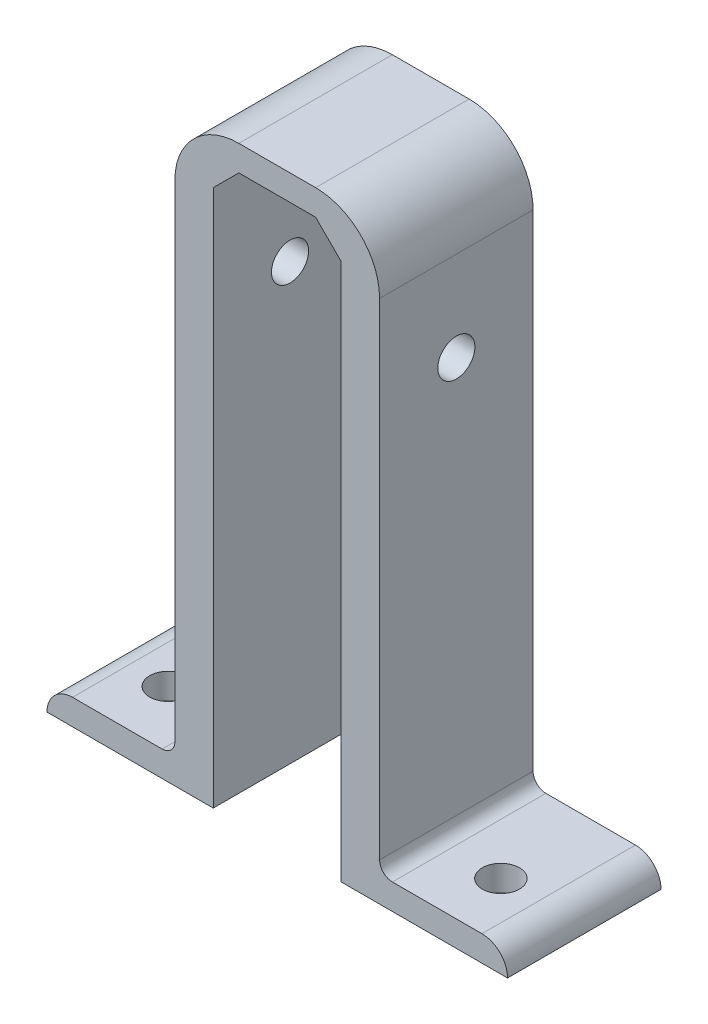
ISO-10303-21;
HEADER;
FILE_DESCRIPTION(('STEP AP214'),'2;1');
FILE_NAME('part.step','',(''),(''),'','','');
FILE_SCHEMA(('AUTOMOTIVE_DESIGN { 1 0 10303 214 1 1 1 1 }'));
ENDSEC;
DATA;
#1=APPLICATION_CONTEXT('core data for automotive mechanical design processes');
#2=APPLICATION_PROTOCOL_DEFINITION('international standard','automotive_design',2000,#1);
#3=PRODUCT_CONTEXT('',#1,'mechanical');
#4=PRODUCT('Part','Part','',(#3));
#5=PRODUCT_RELATED_PRODUCT_CATEGORY('part','',(#4));
#6=PRODUCT_DEFINITION_FORMATION('','',#4);
#7=PRODUCT_DEFINITION_CONTEXT('part definition',#1,'design');
#8=PRODUCT_DEFINITION('design','',#6,#7);
#9=PRODUCT_DEFINITION_SHAPE('','',#8);
#10=(LENGTH_UNIT() NAMED_UNIT(*) SI_UNIT(.MILLI.,.METRE.));
#11=(NAMED_UNIT(*) PLANE_ANGLE_UNIT() SI_UNIT($,.RADIAN.));
#12=(NAMED_UNIT(*) SI_UNIT($,.STERADIAN.) SOLID_ANGLE_UNIT());
#13=UNCERTAINTY_MEASURE_WITH_UNIT(LENGTH_MEASURE(1.E-05),#10,'distance_accuracy_value','');
#14=(GEOMETRIC_REPRESENTATION_CONTEXT(3) GLOBAL_UNCERTAINTY_ASSIGNED_CONTEXT((#13)) GLOBAL_UNIT_ASSIGNED_CONTEXT((#10,
#11,#12)) REPRESENTATION_CONTEXT('',''));
#15=CARTESIAN_POINT('',(0.,0.,0.));
#16=DIRECTION('',(0.,0.,1.));
#17=DIRECTION('',(1.,0.,0.));
#18=AXIS2_PLACEMENT_3D('',#15,#16,#17);
#19=CARTESIAN_POINT('',(0.,0.,12.));
#20=DIRECTION('',(0.,1.,0.));
#21=DIRECTION('',(0.,0.,1.));
#22=AXIS2_PLACEMENT_3D('',#19,#20,#21);
#23=PLANE('',#22);
#24=CARTESIAN_POINT('',(5.,0.,7.51917344477907));
#25=DIRECTION('',(0.,1.,0.));
#26=DIRECTION('',(0.,0.,1.));
#27=AXIS2_PLACEMENT_3D('',#24,#25,#26);
#28=CIRCLE('',#27,1.45);
#29=CARTESIAN_POINT('',(5.,0.,8.96917344477908));
#30=VERTEX_POINT('',#29);
#31=EDGE_CURVE('E376',#30,#30,#28,.T.);
#32=ORIENTED_EDGE('',*,*,#31,.T.);
#33=EDGE_LOOP('',(#32));
#34=FACE_BOUND('',#33,.T.);
#35=DIRECTION('',(1.,0.,0.));
#36=VECTOR('',#35,1.);
#37=CARTESIAN_POINT('',(0.,0.,0.));
#38=LINE('',#37,#36);
#39=CARTESIAN_POINT('',(0.,0.,0.));
#40=VERTEX_POINT('',#39);
#41=CARTESIAN_POINT('',(13.,0.,0.));
#42=VERTEX_POINT('',#41);
#43=EDGE_CURVE('E294',#40,#42,#38,.T.);
#44=ORIENTED_EDGE('',*,*,#43,.T.);
#45=DIRECTION('',(0.,0.,-1.));
#46=VECTOR('',#45,1.);
#47=CARTESIAN_POINT('',(13.,0.,12.));
#48=LINE('',#47,#46);
#49=CARTESIAN_POINT('',(13.,0.,12.));
#50=VERTEX_POINT('',#49);
#51=EDGE_CURVE('E176',#50,#42,#48,.T.);
#52=ORIENTED_EDGE('',*,*,#51,.F.);
#53=DIRECTION('',(1.,0.,0.));
#54=VECTOR('',#53,1.);
#55=CARTESIAN_POINT('',(0.,0.,12.));
#56=LINE('',#55,#54);
#57=CARTESIAN_POINT('',(0.,0.,12.));
#58=VERTEX_POINT('',#57);
#59=EDGE_CURVE('E162',#58,#50,#56,.T.);
#60=ORIENTED_EDGE('',*,*,#59,.F.);
#61=DIRECTION('',(0.,0.,-1.));
#62=VECTOR('',#61,1.);
#63=CARTESIAN_POINT('',(0.,0.,12.));
#64=LINE('',#63,#62);
#65=EDGE_CURVE('E174',#58,#40,#64,.T.);
#66=ORIENTED_EDGE('',*,*,#65,.T.);
#67=EDGE_LOOP('',(#44,#52,#60,#66));
#68=FACE_BOUND('',#67,.T.);
#69=ADVANCED_FACE('F34',(#34,#68),#23,.F.);
#70=CARTESIAN_POINT('',(13.,0.,12.));
#71=DIRECTION('',(-1.,0.,0.));
#72=DIRECTION('',(0.,0.,1.));
#73=AXIS2_PLACEMENT_3D('',#70,#71,#72);
#74=PLANE('',#73);
#75=CARTESIAN_POINT('',(13.,33.9999999999999,6.));
#76=DIRECTION('',(-1.,0.,0.));
#77=DIRECTION('',(0.,0.,1.));
#78=AXIS2_PLACEMENT_3D('',#75,#76,#77);
#79=CIRCLE('',#78,1.45);
#80=CARTESIAN_POINT('',(13.,33.9999999999999,7.45));
#81=VERTEX_POINT('',#80);
#82=EDGE_CURVE('E296',#81,#81,#79,.F.);
#83=ORIENTED_EDGE('',*,*,#82,.F.);
#84=EDGE_LOOP('',(#83));
#85=FACE_BOUND('',#84,.T.);
#86=DIRECTION('',(0.,1.,0.));
#87=VECTOR('',#86,1.);
#88=CARTESIAN_POINT('',(13.,0.,0.));
#89=LINE('',#88,#87);
#90=CARTESIAN_POINT('',(13.,42.,0.));
#91=VERTEX_POINT('',#90);
#92=EDGE_CURVE('E267',#42,#91,#89,.T.);
#93=ORIENTED_EDGE('',*,*,#92,.T.);
#94=DIRECTION('',(0.,0.,1.));
#95=VECTOR('',#94,1.);
#96=CARTESIAN_POINT('',(13.,42.,12.));
#97=LINE('',#96,#95);
#98=CARTESIAN_POINT('',(13.,42.,12.));
#99=VERTEX_POINT('',#98);
#100=EDGE_CURVE('E247',#91,#99,#97,.T.);
#101=ORIENTED_EDGE('',*,*,#100,.T.);
#102=DIRECTION('',(0.,1.,0.));
#103=VECTOR('',#102,1.);
#104=CARTESIAN_POINT('',(13.,0.,12.));
#105=LINE('',#104,#103);
#106=EDGE_CURVE('E178',#50,#99,#105,.T.);
#107=ORIENTED_EDGE('',*,*,#106,.F.);
#108=ORIENTED_EDGE('',*,*,#51,.T.);
#109=EDGE_LOOP('',(#93,#101,#107,#108));
#110=FACE_BOUND('',#109,.T.);
#111=ADVANCED_FACE('F363',(#85,#110),#74,.F.);
#112=CARTESIAN_POINT('',(13.,44.,12.));
#113=DIRECTION('',(0.,1.,0.));
#114=DIRECTION('',(0.,0.,1.));
#115=AXIS2_PLACEMENT_3D('',#112,#113,#114);
#116=PLANE('',#115);
#117=DIRECTION('',(1.,0.,0.));
#118=VECTOR('',#117,1.);
#119=CARTESIAN_POINT('',(13.,44.,12.));
#120=LINE('',#119,#118);
#121=CARTESIAN_POINT('',(15.,44.,12.));
#122=VERTEX_POINT('',#121);
#123=CARTESIAN_POINT('',(21.,44.,12.));
#124=VERTEX_POINT('',#123);
#125=EDGE_CURVE('E276',#122,#124,#120,.T.);
#126=ORIENTED_EDGE('',*,*,#125,.F.);
#127=DIRECTION('',(0.,0.,-1.));
#128=VECTOR('',#127,1.);
#129=CARTESIAN_POINT('',(15.,44.,0.));
#130=LINE('',#129,#128);
#131=CARTESIAN_POINT('',(15.,44.,0.));
#132=VERTEX_POINT('',#131);
#133=EDGE_CURVE('E244',#122,#132,#130,.T.);
#134=ORIENTED_EDGE('',*,*,#133,.T.);
#135=DIRECTION('',(1.,0.,0.));
#136=VECTOR('',#135,1.);
#137=CARTESIAN_POINT('',(13.,44.,0.));
#138=LINE('',#137,#136);
#139=CARTESIAN_POINT('',(21.,44.,0.));
#140=VERTEX_POINT('',#139);
#141=EDGE_CURVE('E260',#132,#140,#138,.T.);
#142=ORIENTED_EDGE('',*,*,#141,.T.);
#143=DIRECTION('',(0.,0.,1.));
#144=VECTOR('',#143,1.);
#145=CARTESIAN_POINT('',(21.,44.,12.));
#146=LINE('',#145,#144);
#147=EDGE_CURVE('E242',#140,#124,#146,.T.);
#148=ORIENTED_EDGE('',*,*,#147,.T.);
#149=EDGE_LOOP('',(#126,#134,#142,#148));
#150=FACE_BOUND('',#149,.T.);
#151=ADVANCED_FACE('F265',(#150),#116,.F.);
#152=CARTESIAN_POINT('',(22.9999999999997,0.,12.));
#153=DIRECTION('',(1.,0.,0.));
#154=DIRECTION('',(0.,1.,0.));
#155=AXIS2_PLACEMENT_3D('',#152,#153,#154);
#156=PLANE('',#155);
#157=CARTESIAN_POINT('',(22.9999999999999,33.9999999999999,6.));
#158=DIRECTION('',(1.,0.,0.));
#159=DIRECTION('',(0.,1.,0.));
#160=AXIS2_PLACEMENT_3D('',#157,#158,#159);
#161=CIRCLE('',#160,1.45);
#162=CARTESIAN_POINT('',(22.9999999999999,35.4499999999999,6.));
#163=VERTEX_POINT('',#162);
#164=EDGE_CURVE('E369',#163,#163,#161,.F.);
#165=ORIENTED_EDGE('',*,*,#164,.F.);
#166=EDGE_LOOP('',(#165));
#167=FACE_BOUND('',#166,.T.);
#168=DIRECTION('',(0.,-1.,0.));
#169=VECTOR('',#168,1.);
#170=CARTESIAN_POINT('',(22.9999999999997,0.,12.));
#171=LINE('',#170,#169);
#172=CARTESIAN_POINT('',(23.,42.,12.));
#173=VERTEX_POINT('',#172);
#174=CARTESIAN_POINT('',(22.9999999999997,0.,12.));
#175=VERTEX_POINT('',#174);
#176=EDGE_CURVE('E273',#173,#175,#171,.T.);
#177=ORIENTED_EDGE('',*,*,#176,.F.);
#178=DIRECTION('',(0.,0.,-1.));
#179=VECTOR('',#178,1.);
#180=CARTESIAN_POINT('',(23.,42.,0.));
#181=LINE('',#180,#179);
#182=CARTESIAN_POINT('',(23.,42.,0.));
#183=VERTEX_POINT('',#182);
#184=EDGE_CURVE('E249',#173,#183,#181,.T.);
#185=ORIENTED_EDGE('',*,*,#184,.T.);
#186=DIRECTION('',(0.,-1.,0.));
#187=VECTOR('',#186,1.);
#188=CARTESIAN_POINT('',(22.9999999999997,0.,0.));
#189=LINE('',#188,#187);
#190=CARTESIAN_POINT('',(22.9999999999997,0.,0.));
#191=VERTEX_POINT('',#190);
#192=EDGE_CURVE('E262',#183,#191,#189,.T.);
#193=ORIENTED_EDGE('',*,*,#192,.T.);
#194=DIRECTION('',(0.,0.,-1.));
#195=VECTOR('',#194,1.);
#196=CARTESIAN_POINT('',(22.9999999999997,0.,12.));
#197=LINE('',#196,#195);
#198=EDGE_CURVE('E189',#175,#191,#197,.T.);
#199=ORIENTED_EDGE('',*,*,#198,.F.);
#200=EDGE_LOOP('',(#177,#185,#193,#199));
#201=FACE_BOUND('',#200,.T.);
#202=ADVANCED_FACE('F270',(#167,#201),#156,.F.);
#203=CARTESIAN_POINT('',(35.9999999999997,-1.2490009027033E-13,12.));
#204=DIRECTION('',(0.,1.,0.));
#205=DIRECTION('',(-1.,0.,0.));
#206=AXIS2_PLACEMENT_3D('',#203,#204,#205);
#207=PLANE('',#206);
#208=CARTESIAN_POINT('',(31.,0.,7.51917344477907));
#209=DIRECTION('',(0.,1.,0.));
#210=DIRECTION('',(-1.,0.,0.));
#211=AXIS2_PLACEMENT_3D('',#208,#209,#210);
#212=CIRCLE('',#211,1.45);
#213=CARTESIAN_POINT('',(29.55,0.,7.51917344477907));
#214=VERTEX_POINT('',#213);
#215=EDGE_CURVE('E196',#214,#214,#212,.T.);
#216=ORIENTED_EDGE('',*,*,#215,.T.);
#217=EDGE_LOOP('',(#216));
#218=FACE_BOUND('',#217,.T.);
#219=DIRECTION('',(1.,0.,0.));
#220=VECTOR('',#219,1.);
#221=CARTESIAN_POINT('',(35.9999999999997,-1.2490009027033E-13,0.));
#222=LINE('',#221,#220);
#223=CARTESIAN_POINT('',(35.9999999999997,-1.2490009027033E-13,0.));
#224=VERTEX_POINT('',#223);
#225=EDGE_CURVE('E300',#191,#224,#222,.T.);
#226=ORIENTED_EDGE('',*,*,#225,.T.);
#227=DIRECTION('',(0.,0.,-1.));
#228=VECTOR('',#227,1.);
#229=CARTESIAN_POINT('',(35.9999999999997,-1.2490009027033E-13,12.));
#230=LINE('',#229,#228);
#231=CARTESIAN_POINT('',(35.9999999999997,-1.2490009027033E-13,12.));
#232=VERTEX_POINT('',#231);
#233=EDGE_CURVE('E293',#232,#224,#230,.T.);
#234=ORIENTED_EDGE('',*,*,#233,.F.);
#235=DIRECTION('',(1.,0.,0.));
#236=VECTOR('',#235,1.);
#237=CARTESIAN_POINT('',(35.9999999999997,-1.2490009027033E-13,12.));
#238=LINE('',#237,#236);
#239=EDGE_CURVE('E275',#175,#232,#238,.T.);
#240=ORIENTED_EDGE('',*,*,#239,.F.);
#241=ORIENTED_EDGE('',*,*,#198,.T.);
#242=EDGE_LOOP('',(#226,#234,#240,#241));
#243=FACE_BOUND('',#242,.T.);
#244=ADVANCED_FACE('F317',(#218,#243),#207,.F.);
#245=CARTESIAN_POINT('',(25.9999999999997,1.99999999999995,12.));
#246=DIRECTION('',(0.,-1.,0.));
#247=DIRECTION('',(1.,0.,0.));
#248=AXIS2_PLACEMENT_3D('',#245,#246,#247);
#249=PLANE('',#248);
#250=CARTESIAN_POINT('',(31.,2.,7.51917344477907));
#251=DIRECTION('',(0.,1.,0.));
#252=DIRECTION('',(1.,0.,0.));
#253=AXIS2_PLACEMENT_3D('',#250,#251,#252);
#254=CIRCLE('',#253,1.45);
#255=CARTESIAN_POINT('',(32.45,2.,7.51917344477907));
#256=VERTEX_POINT('',#255);
#257=EDGE_CURVE('E380',#256,#256,#254,.T.);
#258=ORIENTED_EDGE('',*,*,#257,.F.);
#259=EDGE_LOOP('',(#258));
#260=FACE_BOUND('',#259,.T.);
#261=DIRECTION('',(-1.,0.,0.));
#262=VECTOR('',#261,1.);
#263=CARTESIAN_POINT('',(25.9999999999997,1.99999999999995,12.));
#264=LINE('',#263,#262);
#265=CARTESIAN_POINT('',(33.9999999999997,1.99999999999989,12.));
#266=VERTEX_POINT('',#265);
#267=CARTESIAN_POINT('',(26.9999999999997,1.99999999999994,12.));
#268=VERTEX_POINT('',#267);
#269=EDGE_CURVE('E278',#266,#268,#264,.T.);
#270=ORIENTED_EDGE('',*,*,#269,.F.);
#271=DIRECTION('',(0.,0.,-1.));
#272=VECTOR('',#271,1.);
#273=CARTESIAN_POINT('',(33.9999999999997,1.99999999999989,12.));
#274=LINE('',#273,#272);
#275=CARTESIAN_POINT('',(33.9999999999997,1.99999999999989,0.));
#276=VERTEX_POINT('',#275);
#277=EDGE_CURVE('E234',#266,#276,#274,.T.);
#278=ORIENTED_EDGE('',*,*,#277,.T.);
#279=DIRECTION('',(-1.,0.,0.));
#280=VECTOR('',#279,1.);
#281=CARTESIAN_POINT('',(25.9999999999997,1.99999999999995,0.));
#282=LINE('',#281,#280);
#283=CARTESIAN_POINT('',(26.9999999999997,1.99999999999994,0.));
#284=VERTEX_POINT('',#283);
#285=EDGE_CURVE('E303',#276,#284,#282,.T.);
#286=ORIENTED_EDGE('',*,*,#285,.T.);
#287=DIRECTION('',(0.,0.,-1.));
#288=VECTOR('',#287,1.);
#289=CARTESIAN_POINT('',(26.9999999999997,1.99999999999994,12.));
#290=LINE('',#289,#288);
#291=EDGE_CURVE('E187',#284,#268,#290,.F.);
#292=ORIENTED_EDGE('',*,*,#291,.T.);
#293=EDGE_LOOP('',(#270,#278,#286,#292));
#294=FACE_BOUND('',#293,.T.);
#295=ADVANCED_FACE('F325',(#260,#294),#249,.F.);
#296=CARTESIAN_POINT('',(26.,46.,12.));
#297=DIRECTION('',(-1.,0.,0.));
#298=DIRECTION('',(0.,-1.,0.));
#299=AXIS2_PLACEMENT_3D('',#296,#297,#298);
#300=PLANE('',#299);
#301=CARTESIAN_POINT('',(25.9999999999999,33.9999999999999,6.));
#302=DIRECTION('',(-1.,0.,0.));
#303=DIRECTION('',(0.,-1.,0.));
#304=AXIS2_PLACEMENT_3D('',#301,#302,#303);
#305=CIRCLE('',#304,1.45);
#306=CARTESIAN_POINT('',(25.9999999999999,32.5499999999999,6.));
#307=VERTEX_POINT('',#306);
#308=EDGE_CURVE('E195',#307,#307,#305,.F.);
#309=ORIENTED_EDGE('',*,*,#308,.F.);
#310=EDGE_LOOP('',(#309));
#311=FACE_BOUND('',#310,.T.);
#312=DIRECTION('',(0.,1.,0.));
#313=VECTOR('',#312,1.);
#314=CARTESIAN_POINT('',(26.,46.,0.));
#315=LINE('',#314,#313);
#316=CARTESIAN_POINT('',(25.9999999999997,2.99999999999996,0.));
#317=VERTEX_POINT('',#316);
#318=CARTESIAN_POINT('',(26.,41.,0.));
#319=VERTEX_POINT('',#318);
#320=EDGE_CURVE('E305',#317,#319,#315,.T.);
#321=ORIENTED_EDGE('',*,*,#320,.T.);
#322=DIRECTION('',(0.,0.,-1.));
#323=VECTOR('',#322,1.);
#324=CARTESIAN_POINT('',(26.,41.,12.));
#325=LINE('',#324,#323);
#326=CARTESIAN_POINT('',(26.,41.,12.));
#327=VERTEX_POINT('',#326);
#328=EDGE_CURVE('E225',#319,#327,#325,.F.);
#329=ORIENTED_EDGE('',*,*,#328,.T.);
#330=DIRECTION('',(0.,1.,0.));
#331=VECTOR('',#330,1.);
#332=CARTESIAN_POINT('',(26.,46.,12.));
#333=LINE('',#332,#331);
#334=CARTESIAN_POINT('',(25.9999999999997,2.99999999999996,12.));
#335=VERTEX_POINT('',#334);
#336=EDGE_CURVE('E284',#335,#327,#333,.T.);
#337=ORIENTED_EDGE('',*,*,#336,.F.);
#338=DIRECTION('',(0.,0.,-1.));
#339=VECTOR('',#338,1.);
#340=CARTESIAN_POINT('',(25.9999999999997,2.99999999999995,0.));
#341=LINE('',#340,#339);
#342=EDGE_CURVE('E184',#335,#317,#341,.T.);
#343=ORIENTED_EDGE('',*,*,#342,.T.);
#344=EDGE_LOOP('',(#321,#329,#337,#343));
#345=FACE_BOUND('',#344,.T.);
#346=ADVANCED_FACE('F333',(#311,#345),#300,.F.);
#347=CARTESIAN_POINT('',(26.,46.,12.));
#348=DIRECTION('',(0.,-1.,0.));
#349=DIRECTION('',(0.,0.,-1.));
#350=AXIS2_PLACEMENT_3D('',#347,#348,#349);
#351=PLANE('',#350);
#352=DIRECTION('',(-1.,0.,0.));
#353=VECTOR('',#352,1.);
#354=CARTESIAN_POINT('',(26.,46.,12.));
#355=LINE('',#354,#353);
#356=CARTESIAN_POINT('',(21.,46.,12.));
#357=VERTEX_POINT('',#356);
#358=CARTESIAN_POINT('',(15.,46.,12.));
#359=VERTEX_POINT('',#358);
#360=EDGE_CURVE('E287',#357,#359,#355,.T.);
#361=ORIENTED_EDGE('',*,*,#360,.F.);
#362=DIRECTION('',(0.,0.,-1.));
#363=VECTOR('',#362,1.);
#364=CARTESIAN_POINT('',(21.,46.,12.));
#365=LINE('',#364,#363);
#366=CARTESIAN_POINT('',(21.,46.,0.));
#367=VERTEX_POINT('',#366);
#368=EDGE_CURVE('E218',#357,#367,#365,.T.);
#369=ORIENTED_EDGE('',*,*,#368,.T.);
#370=DIRECTION('',(-1.,0.,0.));
#371=VECTOR('',#370,1.);
#372=CARTESIAN_POINT('',(26.,46.,0.));
#373=LINE('',#372,#371);
#374=CARTESIAN_POINT('',(15.,46.,0.));
#375=VERTEX_POINT('',#374);
#376=EDGE_CURVE('E308',#367,#375,#373,.T.);
#377=ORIENTED_EDGE('',*,*,#376,.T.);
#378=DIRECTION('',(0.,0.,-1.));
#379=VECTOR('',#378,1.);
#380=CARTESIAN_POINT('',(15.,46.,12.));
#381=LINE('',#380,#379);
#382=EDGE_CURVE('E216',#375,#359,#381,.F.);
#383=ORIENTED_EDGE('',*,*,#382,.T.);
#384=EDGE_LOOP('',(#361,#369,#377,#383));
#385=FACE_BOUND('',#384,.T.);
#386=ADVANCED_FACE('F344',(#385),#351,.F.);
#387=CARTESIAN_POINT('',(9.99999999999999,46.,12.));
#388=DIRECTION('',(1.,0.,0.));
#389=DIRECTION('',(0.,1.,0.));
#390=AXIS2_PLACEMENT_3D('',#387,#388,#389);
#391=PLANE('',#390);
#392=CARTESIAN_POINT('',(9.99999999999999,33.9999999999999,6.));
#393=DIRECTION('',(1.,0.,0.));
#394=DIRECTION('',(0.,1.,0.));
#395=AXIS2_PLACEMENT_3D('',#392,#393,#394);
#396=CIRCLE('',#395,1.45);
#397=CARTESIAN_POINT('',(9.99999999999999,35.4499999999999,6.));
#398=VERTEX_POINT('',#397);
#399=EDGE_CURVE('E193',#398,#398,#396,.F.);
#400=ORIENTED_EDGE('',*,*,#399,.F.);
#401=EDGE_LOOP('',(#400));
#402=FACE_BOUND('',#401,.T.);
#403=DIRECTION('',(0.,-1.,0.));
#404=VECTOR('',#403,1.);
#405=CARTESIAN_POINT('',(9.99999999999999,46.,12.));
#406=LINE('',#405,#404);
#407=CARTESIAN_POINT('',(9.99999999999999,41.,12.));
#408=VERTEX_POINT('',#407);
#409=CARTESIAN_POINT('',(10.,3.,12.));
#410=VERTEX_POINT('',#409);
#411=EDGE_CURVE('E290',#408,#410,#406,.T.);
#412=ORIENTED_EDGE('',*,*,#411,.F.);
#413=DIRECTION('',(0.,0.,-1.));
#414=VECTOR('',#413,1.);
#415=CARTESIAN_POINT('',(9.99999999999999,41.,12.));
#416=LINE('',#415,#414);
#417=CARTESIAN_POINT('',(9.99999999999999,41.,0.));
#418=VERTEX_POINT('',#417);
#419=EDGE_CURVE('E231',#408,#418,#416,.T.);
#420=ORIENTED_EDGE('',*,*,#419,.T.);
#421=DIRECTION('',(0.,-1.,0.));
#422=VECTOR('',#421,1.);
#423=CARTESIAN_POINT('',(9.99999999999999,46.,0.));
#424=LINE('',#423,#422);
#425=CARTESIAN_POINT('',(10.,3.,0.));
#426=VERTEX_POINT('',#425);
#427=EDGE_CURVE('E311',#418,#426,#424,.T.);
#428=ORIENTED_EDGE('',*,*,#427,.T.);
#429=DIRECTION('',(0.,0.,-1.));
#430=VECTOR('',#429,1.);
#431=CARTESIAN_POINT('',(10.,3.,12.));
#432=LINE('',#431,#430);
#433=EDGE_CURVE('E203',#426,#410,#432,.F.);
#434=ORIENTED_EDGE('',*,*,#433,.T.);
#435=EDGE_LOOP('',(#412,#420,#428,#434));
#436=FACE_BOUND('',#435,.T.);
#437=ADVANCED_FACE('F351',(#402,#436),#391,.F.);
#438=CARTESIAN_POINT('',(10.,2.,12.));
#439=DIRECTION('',(0.,-1.,0.));
#440=DIRECTION('',(1.,0.,0.));
#441=AXIS2_PLACEMENT_3D('',#438,#439,#440);
#442=PLANE('',#441);
#443=CARTESIAN_POINT('',(5.,2.,7.51917344477907));
#444=DIRECTION('',(0.,1.,0.));
#445=DIRECTION('',(-1.,0.,0.));
#446=AXIS2_PLACEMENT_3D('',#443,#444,#445);
#447=CIRCLE('',#446,1.45);
#448=CARTESIAN_POINT('',(3.55,2.,7.51917344477907));
#449=VERTEX_POINT('',#448);
#450=EDGE_CURVE('E379',#449,#449,#447,.T.);
#451=ORIENTED_EDGE('',*,*,#450,.F.);
#452=EDGE_LOOP('',(#451));
#453=FACE_BOUND('',#452,.T.);
#454=DIRECTION('',(-1.,0.,0.));
#455=VECTOR('',#454,1.);
#456=CARTESIAN_POINT('',(10.,2.,0.));
#457=LINE('',#456,#455);
#458=CARTESIAN_POINT('',(9.,2.,0.));
#459=VERTEX_POINT('',#458);
#460=CARTESIAN_POINT('',(2.,2.,0.));
#461=VERTEX_POINT('',#460);
#462=EDGE_CURVE('E179',#459,#461,#457,.T.);
#463=ORIENTED_EDGE('',*,*,#462,.T.);
#464=DIRECTION('',(0.,0.,-1.));
#465=VECTOR('',#464,1.);
#466=CARTESIAN_POINT('',(2.,2.,12.));
#467=LINE('',#466,#465);
#468=CARTESIAN_POINT('',(2.,2.,12.));
#469=VERTEX_POINT('',#468);
#470=EDGE_CURVE('E240',#461,#469,#467,.F.);
#471=ORIENTED_EDGE('',*,*,#470,.T.);
#472=DIRECTION('',(-1.,0.,0.));
#473=VECTOR('',#472,1.);
#474=CARTESIAN_POINT('',(10.,2.,12.));
#475=LINE('',#474,#473);
#476=CARTESIAN_POINT('',(9.,2.,12.));
#477=VERTEX_POINT('',#476);
#478=EDGE_CURVE('E165',#477,#469,#475,.T.);
#479=ORIENTED_EDGE('',*,*,#478,.F.);
#480=DIRECTION('',(0.,0.,-1.));
#481=VECTOR('',#480,1.);
#482=CARTESIAN_POINT('',(9.,2.,0.));
#483=LINE('',#482,#481);
#484=EDGE_CURVE('E200',#477,#459,#483,.T.);
#485=ORIENTED_EDGE('',*,*,#484,.T.);
#486=EDGE_LOOP('',(#463,#471,#479,#485));
#487=FACE_BOUND('',#486,.T.);
#488=ADVANCED_FACE('F359',(#453,#487),#442,.F.);
#489=CARTESIAN_POINT('',(0.,0.,12.));
#490=DIRECTION('',(0.,0.,1.));
#491=DIRECTION('',(1.,0.,0.));
#492=AXIS2_PLACEMENT_3D('',#489,#490,#491);
#493=PLANE('',#492);
#494=ORIENTED_EDGE('',*,*,#239,.T.);
#495=CARTESIAN_POINT('',(33.9999999999997,-1.10762093941119E-13,12.));
#496=DIRECTION('',(0.,0.,1.));
#497=DIRECTION('',(1.,0.,0.));
#498=AXIS2_PLACEMENT_3D('',#495,#496,#497);
#499=CIRCLE('',#498,2.);
#500=EDGE_CURVE('E169',#232,#266,#499,.T.);
#501=ORIENTED_EDGE('',*,*,#500,.T.);
#502=ORIENTED_EDGE('',*,*,#269,.T.);
#503=CARTESIAN_POINT('',(26.9999999999997,2.99999999999994,12.));
#504=DIRECTION('',(0.,0.,1.));
#505=DIRECTION('',(1.,0.,0.));
#506=AXIS2_PLACEMENT_3D('',#503,#504,#505);
#507=CIRCLE('',#506,1.);
#508=EDGE_CURVE('E209',#268,#335,#507,.F.);
#509=ORIENTED_EDGE('',*,*,#508,.T.);
#510=ORIENTED_EDGE('',*,*,#336,.T.);
#511=CARTESIAN_POINT('',(21.,41.,12.));
#512=DIRECTION('',(0.,0.,1.));
#513=DIRECTION('',(1.,0.,0.));
#514=AXIS2_PLACEMENT_3D('',#511,#512,#513);
#515=CIRCLE('',#514,5.);
#516=EDGE_CURVE('E229',#327,#357,#515,.T.);
#517=ORIENTED_EDGE('',*,*,#516,.T.);
#518=ORIENTED_EDGE('',*,*,#360,.T.);
#519=CARTESIAN_POINT('',(15.,41.,12.));
#520=DIRECTION('',(0.,0.,1.));
#521=DIRECTION('',(1.,0.,0.));
#522=AXIS2_PLACEMENT_3D('',#519,#520,#521);
#523=CIRCLE('',#522,5.);
#524=EDGE_CURVE('E227',#359,#408,#523,.T.);
#525=ORIENTED_EDGE('',*,*,#524,.T.);
#526=ORIENTED_EDGE('',*,*,#411,.T.);
#527=CARTESIAN_POINT('',(9.,3.,12.));
#528=DIRECTION('',(0.,0.,1.));
#529=DIRECTION('',(1.,0.,0.));
#530=AXIS2_PLACEMENT_3D('',#527,#528,#529);
#531=CIRCLE('',#530,1.);
#532=EDGE_CURVE('E214',#410,#477,#531,.F.);
#533=ORIENTED_EDGE('',*,*,#532,.T.);
#534=ORIENTED_EDGE('',*,*,#478,.T.);
#535=CARTESIAN_POINT('',(2.,0.,12.));
#536=DIRECTION('',(0.,0.,1.));
#537=DIRECTION('',(1.,0.,0.));
#538=AXIS2_PLACEMENT_3D('',#535,#536,#537);
#539=CIRCLE('',#538,2.);
#540=EDGE_CURVE('E158',#469,#58,#539,.T.);
#541=ORIENTED_EDGE('',*,*,#540,.T.);
#542=ORIENTED_EDGE('',*,*,#59,.T.);
#543=ORIENTED_EDGE('',*,*,#106,.T.);
#544=DIRECTION('',(-0.707106781186551,-0.707106781186544,0.));
#545=VECTOR('',#544,1.);
#546=CARTESIAN_POINT('',(15.,44.,12.));
#547=LINE('',#546,#545);
#548=EDGE_CURVE('E253',#99,#122,#547,.F.);
#549=ORIENTED_EDGE('',*,*,#548,.T.);
#550=ORIENTED_EDGE('',*,*,#125,.T.);
#551=DIRECTION('',(-0.707106781186544,0.707106781186551,0.));
#552=VECTOR('',#551,1.);
#553=CARTESIAN_POINT('',(23.,42.,12.));
#554=LINE('',#553,#552);
#555=EDGE_CURVE('E11',#124,#173,#554,.F.);
#556=ORIENTED_EDGE('',*,*,#555,.T.);
#557=ORIENTED_EDGE('',*,*,#176,.T.);
#558=EDGE_LOOP('',(#494,#501,#502,#509,#510,#517,#518,#525,#526,#533,#534,#541,#542,#543,#549,
#550,#556,#557));
#559=FACE_BOUND('',#558,.T.);
#560=ADVANCED_FACE('F160',(#559),#493,.T.);
#561=CARTESIAN_POINT('',(0.,0.,0.));
#562=DIRECTION('',(0.,0.,1.));
#563=DIRECTION('',(1.,0.,0.));
#564=AXIS2_PLACEMENT_3D('',#561,#562,#563);
#565=PLANE('',#564);
#566=ORIENTED_EDGE('',*,*,#285,.F.);
#567=CARTESIAN_POINT('',(33.9999999999997,-1.10762093941119E-13,0.));
#568=DIRECTION('',(0.,0.,1.));
#569=DIRECTION('',(1.,0.,0.));
#570=AXIS2_PLACEMENT_3D('',#567,#568,#569);
#571=CIRCLE('',#570,2.);
#572=EDGE_CURVE('E170',#276,#224,#571,.F.);
#573=ORIENTED_EDGE('',*,*,#572,.T.);
#574=ORIENTED_EDGE('',*,*,#225,.F.);
#575=ORIENTED_EDGE('',*,*,#192,.F.);
#576=DIRECTION('',(0.707106781186544,-0.707106781186551,0.));
#577=VECTOR('',#576,1.);
#578=CARTESIAN_POINT('',(32.5000000000001,32.4999999999998,0.));
#579=LINE('',#578,#577);
#580=EDGE_CURVE('E43',#183,#140,#579,.F.);
#581=ORIENTED_EDGE('',*,*,#580,.T.);
#582=ORIENTED_EDGE('',*,*,#141,.F.);
#583=DIRECTION('',(0.707106781186551,0.707106781186544,0.));
#584=VECTOR('',#583,1.);
#585=CARTESIAN_POINT('',(-14.5000000000001,14.5000000000002,0.));
#586=LINE('',#585,#584);
#587=EDGE_CURVE('E251',#132,#91,#586,.F.);
#588=ORIENTED_EDGE('',*,*,#587,.T.);
#589=ORIENTED_EDGE('',*,*,#92,.F.);
#590=ORIENTED_EDGE('',*,*,#43,.F.);
#591=CARTESIAN_POINT('',(2.,0.,0.));
#592=DIRECTION('',(0.,0.,1.));
#593=DIRECTION('',(1.,0.,0.));
#594=AXIS2_PLACEMENT_3D('',#591,#592,#593);
#595=CIRCLE('',#594,2.);
#596=EDGE_CURVE('E182',#40,#461,#595,.F.);
#597=ORIENTED_EDGE('',*,*,#596,.T.);
#598=ORIENTED_EDGE('',*,*,#462,.F.);
#599=CARTESIAN_POINT('',(9.,3.,0.));
#600=DIRECTION('',(0.,0.,1.));
#601=DIRECTION('',(1.,0.,0.));
#602=AXIS2_PLACEMENT_3D('',#599,#600,#601);
#603=CIRCLE('',#602,1.);
#604=EDGE_CURVE('E211',#459,#426,#603,.T.);
#605=ORIENTED_EDGE('',*,*,#604,.T.);
#606=ORIENTED_EDGE('',*,*,#427,.F.);
#607=CARTESIAN_POINT('',(15.,41.,0.));
#608=DIRECTION('',(0.,0.,1.));
#609=DIRECTION('',(1.,0.,0.));
#610=AXIS2_PLACEMENT_3D('',#607,#608,#609);
#611=CIRCLE('',#610,5.);
#612=EDGE_CURVE('E221',#418,#375,#611,.F.);
#613=ORIENTED_EDGE('',*,*,#612,.T.);
#614=ORIENTED_EDGE('',*,*,#376,.F.);
#615=CARTESIAN_POINT('',(21.,41.,0.));
#616=DIRECTION('',(0.,0.,1.));
#617=DIRECTION('',(1.,0.,0.));
#618=AXIS2_PLACEMENT_3D('',#615,#616,#617);
#619=CIRCLE('',#618,5.);
#620=EDGE_CURVE('E223',#367,#319,#619,.F.);
#621=ORIENTED_EDGE('',*,*,#620,.T.);
#622=ORIENTED_EDGE('',*,*,#320,.F.);
#623=CARTESIAN_POINT('',(26.9999999999997,2.99999999999994,0.));
#624=DIRECTION('',(0.,0.,1.));
#625=DIRECTION('',(1.,0.,0.));
#626=AXIS2_PLACEMENT_3D('',#623,#624,#625);
#627=CIRCLE('',#626,1.);
#628=EDGE_CURVE('E206',#317,#284,#627,.T.);
#629=ORIENTED_EDGE('',*,*,#628,.T.);
#630=EDGE_LOOP('',(#566,#573,#574,#575,#581,#582,#588,#589,#590,#597,#598,#605,#606,#613,#614,
#621,#622,#629));
#631=FACE_BOUND('',#630,.T.);
#632=ADVANCED_FACE('F259',(#631),#565,.F.);
#633=CARTESIAN_POINT('',(28.,33.9999999999999,6.));
#634=DIRECTION('',(-1.,0.,0.));
#635=DIRECTION('',(0.,-1.,0.));
#636=AXIS2_PLACEMENT_3D('',#633,#634,#635);
#637=CYLINDRICAL_SURFACE('',#636,1.45);
#638=ORIENTED_EDGE('',*,*,#399,.T.);
#639=EDGE_LOOP('',(#638));
#640=FACE_BOUND('',#639,.T.);
#641=ORIENTED_EDGE('',*,*,#82,.T.);
#642=EDGE_LOOP('',(#641));
#643=FACE_BOUND('',#642,.T.);
#644=ADVANCED_FACE('F446',(#640,#643),#637,.F.);
#645=ORIENTED_EDGE('',*,*,#308,.T.);
#646=EDGE_LOOP('',(#645));
#647=FACE_BOUND('',#646,.T.);
#648=ORIENTED_EDGE('',*,*,#164,.T.);
#649=EDGE_LOOP('',(#648));
#650=FACE_BOUND('',#649,.T.);
#651=ADVANCED_FACE('F577',(#647,#650),#637,.F.);
#652=CARTESIAN_POINT('',(5.,-13.,7.51917344477907));
#653=DIRECTION('',(0.,1.,0.));
#654=DIRECTION('',(-1.,0.,0.));
#655=AXIS2_PLACEMENT_3D('',#652,#653,#654);
#656=CYLINDRICAL_SURFACE('',#655,1.45);
#657=ORIENTED_EDGE('',*,*,#450,.T.);
#658=EDGE_LOOP('',(#657));
#659=FACE_BOUND('',#658,.T.);
#660=ORIENTED_EDGE('',*,*,#31,.F.);
#661=EDGE_LOOP('',(#660));
#662=FACE_BOUND('',#661,.T.);
#663=ADVANCED_FACE('F386',(#659,#662),#656,.F.);
#664=CARTESIAN_POINT('',(31.,-13.,7.51917344477907));
#665=DIRECTION('',(0.,1.,0.));
#666=DIRECTION('',(-1.,0.,0.));
#667=AXIS2_PLACEMENT_3D('',#664,#665,#666);
#668=CYLINDRICAL_SURFACE('',#667,1.45);
#669=ORIENTED_EDGE('',*,*,#257,.T.);
#670=EDGE_LOOP('',(#669));
#671=FACE_BOUND('',#670,.T.);
#672=ORIENTED_EDGE('',*,*,#215,.F.);
#673=EDGE_LOOP('',(#672));
#674=FACE_BOUND('',#673,.T.);
#675=ADVANCED_FACE('F411',(#671,#674),#668,.F.);
#676=CARTESIAN_POINT('',(26.9999999999997,2.99999999999994,12.));
#677=DIRECTION('',(0.,0.,1.));
#678=DIRECTION('',(1.,0.,0.));
#679=AXIS2_PLACEMENT_3D('',#676,#677,#678);
#680=CYLINDRICAL_SURFACE('',#679,1.);
#681=ORIENTED_EDGE('',*,*,#508,.F.);
#682=ORIENTED_EDGE('',*,*,#291,.F.);
#683=ORIENTED_EDGE('',*,*,#628,.F.);
#684=ORIENTED_EDGE('',*,*,#342,.F.);
#685=EDGE_LOOP('',(#681,#682,#683,#684));
#686=FACE_BOUND('',#685,.T.);
#687=ADVANCED_FACE('F336',(#686),#680,.F.);
#688=CARTESIAN_POINT('',(9.,3.,12.));
#689=DIRECTION('',(0.,0.,1.));
#690=DIRECTION('',(1.,0.,0.));
#691=AXIS2_PLACEMENT_3D('',#688,#689,#690);
#692=CYLINDRICAL_SURFACE('',#691,1.);
#693=ORIENTED_EDGE('',*,*,#532,.F.);
#694=ORIENTED_EDGE('',*,*,#433,.F.);
#695=ORIENTED_EDGE('',*,*,#604,.F.);
#696=ORIENTED_EDGE('',*,*,#484,.F.);
#697=EDGE_LOOP('',(#693,#694,#695,#696));
#698=FACE_BOUND('',#697,.T.);
#699=ADVANCED_FACE('F357',(#698),#692,.F.);
#700=CARTESIAN_POINT('',(21.,41.,12.));
#701=DIRECTION('',(0.,0.,-1.));
#702=DIRECTION('',(-1.,0.,0.));
#703=AXIS2_PLACEMENT_3D('',#700,#701,#702);
#704=CYLINDRICAL_SURFACE('',#703,5.);
#705=ORIENTED_EDGE('',*,*,#516,.F.);
#706=ORIENTED_EDGE('',*,*,#328,.F.);
#707=ORIENTED_EDGE('',*,*,#620,.F.);
#708=ORIENTED_EDGE('',*,*,#368,.F.);
#709=EDGE_LOOP('',(#705,#706,#707,#708));
#710=FACE_BOUND('',#709,.T.);
#711=ADVANCED_FACE('F339',(#710),#704,.T.);
#712=CARTESIAN_POINT('',(15.,41.,12.));
#713=DIRECTION('',(0.,0.,-1.));
#714=DIRECTION('',(-1.,0.,0.));
#715=AXIS2_PLACEMENT_3D('',#712,#713,#714);
#716=CYLINDRICAL_SURFACE('',#715,5.);
#717=ORIENTED_EDGE('',*,*,#524,.F.);
#718=ORIENTED_EDGE('',*,*,#382,.F.);
#719=ORIENTED_EDGE('',*,*,#612,.F.);
#720=ORIENTED_EDGE('',*,*,#419,.F.);
#721=EDGE_LOOP('',(#717,#718,#719,#720));
#722=FACE_BOUND('',#721,.T.);
#723=ADVANCED_FACE('F347',(#722),#716,.T.);
#724=CARTESIAN_POINT('',(33.9999999999997,-1.10762093941119E-13,12.));
#725=DIRECTION('',(0.,0.,-1.));
#726=DIRECTION('',(-1.,0.,0.));
#727=AXIS2_PLACEMENT_3D('',#724,#725,#726);
#728=CYLINDRICAL_SURFACE('',#727,2.);
#729=ORIENTED_EDGE('',*,*,#500,.F.);
#730=ORIENTED_EDGE('',*,*,#233,.T.);
#731=ORIENTED_EDGE('',*,*,#572,.F.);
#732=ORIENTED_EDGE('',*,*,#277,.F.);
#733=EDGE_LOOP('',(#729,#730,#731,#732));
#734=FACE_BOUND('',#733,.T.);
#735=ADVANCED_FACE('F322',(#734),#728,.T.);
#736=CARTESIAN_POINT('',(2.,0.,12.));
#737=DIRECTION('',(0.,0.,-1.));
#738=DIRECTION('',(-1.,0.,0.));
#739=AXIS2_PLACEMENT_3D('',#736,#737,#738);
#740=CYLINDRICAL_SURFACE('',#739,2.);
#741=ORIENTED_EDGE('',*,*,#540,.F.);
#742=ORIENTED_EDGE('',*,*,#470,.F.);
#743=ORIENTED_EDGE('',*,*,#596,.F.);
#744=ORIENTED_EDGE('',*,*,#65,.F.);
#745=EDGE_LOOP('',(#741,#742,#743,#744));
#746=FACE_BOUND('',#745,.T.);
#747=ADVANCED_FACE('F181',(#746),#740,.T.);
#748=CARTESIAN_POINT('',(15.,44.,12.));
#749=DIRECTION('',(0.707106781186544,-0.707106781186551,0.));
#750=DIRECTION('',(0.,0.,1.));
#751=AXIS2_PLACEMENT_3D('',#748,#749,#750);
#752=PLANE('',#751);
#753=ORIENTED_EDGE('',*,*,#548,.F.);
#754=ORIENTED_EDGE('',*,*,#100,.F.);
#755=ORIENTED_EDGE('',*,*,#587,.F.);
#756=ORIENTED_EDGE('',*,*,#133,.F.);
#757=EDGE_LOOP('',(#753,#754,#755,#756));
#758=FACE_BOUND('',#757,.T.);
#759=ADVANCED_FACE('F421',(#758),#752,.T.);
#760=CARTESIAN_POINT('',(23.,42.,12.));
#761=DIRECTION('',(-0.707106781186551,-0.707106781186544,0.));
#762=DIRECTION('',(0.,0.,1.));
#763=AXIS2_PLACEMENT_3D('',#760,#761,#762);
#764=PLANE('',#763);
#765=ORIENTED_EDGE('',*,*,#555,.F.);
#766=ORIENTED_EDGE('',*,*,#147,.F.);
#767=ORIENTED_EDGE('',*,*,#580,.F.);
#768=ORIENTED_EDGE('',*,*,#184,.F.);
#769=EDGE_LOOP('',(#765,#766,#767,#768));
#770=FACE_BOUND('',#769,.T.);
#771=ADVANCED_FACE('F37',(#770),#764,.T.);
#772=CLOSED_SHELL('',(#69,#111,#151,#202,#244,#295,#346,#386,#437,#488,#560,#632,#644,#651,#663,
#675,#687,#699,#711,#723,#735,#747,#759,#771));
#773=MANIFOLD_SOLID_BREP('B2',#772);
#774=ADVANCED_BREP_SHAPE_REPRESENTATION('',(#18,#773),#14);
#775=SHAPE_DEFINITION_REPRESENTATION(#9,#774);
ENDSEC;
END-ISO-10303-21;
